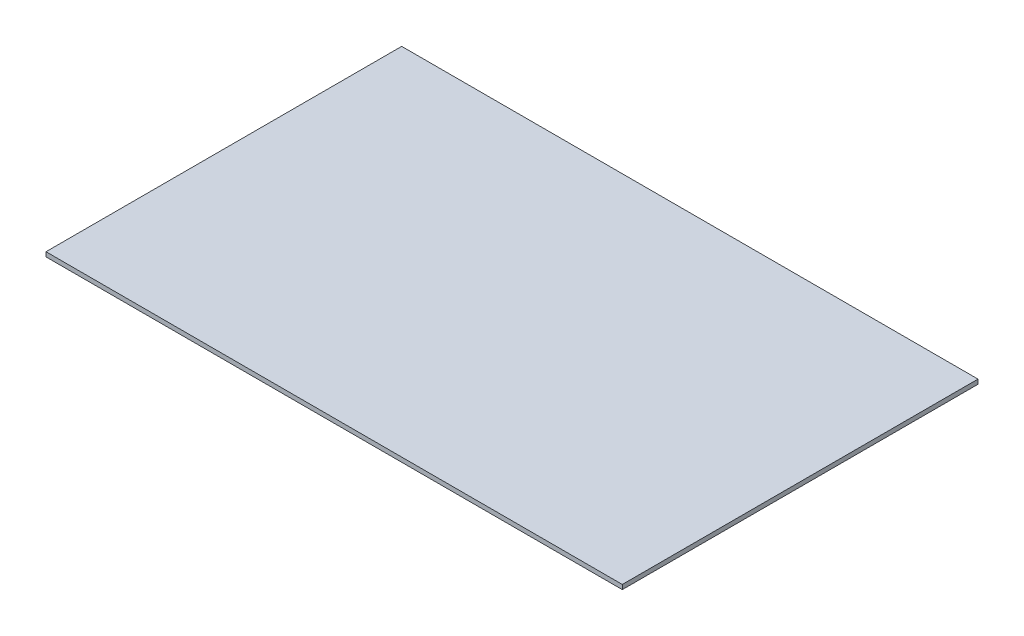
ISO-10303-21;
HEADER;
FILE_DESCRIPTION(('STEP AP214'),'2;1');
FILE_NAME('part.step','',(''),(''),'','','');
FILE_SCHEMA(('AUTOMOTIVE_DESIGN { 1 0 10303 214 1 1 1 1 }'));
ENDSEC;
DATA;
#1=APPLICATION_CONTEXT('core data for automotive mechanical design processes');
#2=APPLICATION_PROTOCOL_DEFINITION('international standard','automotive_design',2000,#1);
#3=PRODUCT_CONTEXT('',#1,'mechanical');
#4=PRODUCT('Part','Part','',(#3));
#5=PRODUCT_RELATED_PRODUCT_CATEGORY('part','',(#4));
#6=PRODUCT_DEFINITION_FORMATION('','',#4);
#7=PRODUCT_DEFINITION_CONTEXT('part definition',#1,'design');
#8=PRODUCT_DEFINITION('design','',#6,#7);
#9=PRODUCT_DEFINITION_SHAPE('','',#8);
#10=(LENGTH_UNIT() NAMED_UNIT(*) SI_UNIT(.MILLI.,.METRE.));
#11=(NAMED_UNIT(*) PLANE_ANGLE_UNIT() SI_UNIT($,.RADIAN.));
#12=(NAMED_UNIT(*) SI_UNIT($,.STERADIAN.) SOLID_ANGLE_UNIT());
#13=UNCERTAINTY_MEASURE_WITH_UNIT(LENGTH_MEASURE(1.E-05),#10,'distance_accuracy_value','');
#14=(GEOMETRIC_REPRESENTATION_CONTEXT(3) GLOBAL_UNCERTAINTY_ASSIGNED_CONTEXT((#13)) GLOBAL_UNIT_ASSIGNED_CONTEXT((#10,
#11,#12)) REPRESENTATION_CONTEXT('',''));
#15=CARTESIAN_POINT('',(0.,0.,0.));
#16=DIRECTION('',(0.,0.,1.));
#17=DIRECTION('',(1.,0.,0.));
#18=AXIS2_PLACEMENT_3D('',#15,#16,#17);
#19=CARTESIAN_POINT('',(0.,1.,39.5));
#20=DIRECTION('',(0.,0.,-1.));
#21=DIRECTION('',(-1.,0.,0.));
#22=AXIS2_PLACEMENT_3D('',#19,#20,#21);
#23=PLANE('',#22);
#24=DIRECTION('',(1.,0.,0.));
#25=VECTOR('',#24,1.);
#26=CARTESIAN_POINT('',(0.,0.,39.5));
#27=LINE('',#26,#25);
#28=CARTESIAN_POINT('',(-64.,0.,39.5));
#29=VERTEX_POINT('',#28);
#30=CARTESIAN_POINT('',(64.,0.,39.5));
#31=VERTEX_POINT('',#30);
#32=EDGE_CURVE('E60',#29,#31,#27,.T.);
#33=ORIENTED_EDGE('',*,*,#32,.T.);
#34=DIRECTION('',(0.,-1.,0.));
#35=VECTOR('',#34,1.);
#36=CARTESIAN_POINT('',(64.,1.,39.5));
#37=LINE('',#36,#35);
#38=CARTESIAN_POINT('',(64.,1.,39.5));
#39=VERTEX_POINT('',#38);
#40=EDGE_CURVE('E11',#39,#31,#37,.T.);
#41=ORIENTED_EDGE('',*,*,#40,.F.);
#42=DIRECTION('',(1.,0.,0.));
#43=VECTOR('',#42,1.);
#44=CARTESIAN_POINT('',(0.,1.,39.5));
#45=LINE('',#44,#43);
#46=CARTESIAN_POINT('',(-64.,1.,39.5));
#47=VERTEX_POINT('',#46);
#48=EDGE_CURVE('E65',#47,#39,#45,.T.);
#49=ORIENTED_EDGE('',*,*,#48,.F.);
#50=DIRECTION('',(0.,-1.,0.));
#51=VECTOR('',#50,1.);
#52=CARTESIAN_POINT('',(-64.,1.,39.5));
#53=LINE('',#52,#51);
#54=EDGE_CURVE('E82',#47,#29,#53,.T.);
#55=ORIENTED_EDGE('',*,*,#54,.T.);
#56=EDGE_LOOP('',(#33,#41,#49,#55));
#57=FACE_BOUND('',#56,.T.);
#58=ADVANCED_FACE('F33',(#57),#23,.F.);
#59=CARTESIAN_POINT('',(64.,1.,-39.5));
#60=DIRECTION('',(-1.,0.,0.));
#61=DIRECTION('',(0.,0.,1.));
#62=AXIS2_PLACEMENT_3D('',#59,#60,#61);
#63=PLANE('',#62);
#64=DIRECTION('',(0.,0.,-1.));
#65=VECTOR('',#64,1.);
#66=CARTESIAN_POINT('',(64.,0.,-39.5));
#67=LINE('',#66,#65);
#68=CARTESIAN_POINT('',(64.,0.,-39.5));
#69=VERTEX_POINT('',#68);
#70=EDGE_CURVE('E79',#31,#69,#67,.T.);
#71=ORIENTED_EDGE('',*,*,#70,.T.);
#72=DIRECTION('',(0.,-1.,0.));
#73=VECTOR('',#72,1.);
#74=CARTESIAN_POINT('',(64.,1.,-39.5));
#75=LINE('',#74,#73);
#76=CARTESIAN_POINT('',(64.,1.,-39.5));
#77=VERTEX_POINT('',#76);
#78=EDGE_CURVE('E41',#77,#69,#75,.T.);
#79=ORIENTED_EDGE('',*,*,#78,.F.);
#80=DIRECTION('',(0.,0.,-1.));
#81=VECTOR('',#80,1.);
#82=CARTESIAN_POINT('',(64.,1.,-39.5));
#83=LINE('',#82,#81);
#84=EDGE_CURVE('E49',#39,#77,#83,.T.);
#85=ORIENTED_EDGE('',*,*,#84,.F.);
#86=ORIENTED_EDGE('',*,*,#40,.T.);
#87=EDGE_LOOP('',(#71,#79,#85,#86));
#88=FACE_BOUND('',#87,.T.);
#89=ADVANCED_FACE('F106',(#88),#63,.F.);
#90=CARTESIAN_POINT('',(0.,1.,-39.5));
#91=DIRECTION('',(0.,0.,1.));
#92=DIRECTION('',(1.,0.,0.));
#93=AXIS2_PLACEMENT_3D('',#90,#91,#92);
#94=PLANE('',#93);
#95=DIRECTION('',(-1.,0.,0.));
#96=VECTOR('',#95,1.);
#97=CARTESIAN_POINT('',(0.,0.,-39.5));
#98=LINE('',#97,#96);
#99=CARTESIAN_POINT('',(-64.,0.,-39.5));
#100=VERTEX_POINT('',#99);
#101=EDGE_CURVE('E96',#69,#100,#98,.T.);
#102=ORIENTED_EDGE('',*,*,#101,.T.);
#103=DIRECTION('',(0.,-1.,0.));
#104=VECTOR('',#103,1.);
#105=CARTESIAN_POINT('',(-64.,1.,-39.5));
#106=LINE('',#105,#104);
#107=CARTESIAN_POINT('',(-64.,1.,-39.5));
#108=VERTEX_POINT('',#107);
#109=EDGE_CURVE('E80',#108,#100,#106,.T.);
#110=ORIENTED_EDGE('',*,*,#109,.F.);
#111=DIRECTION('',(-1.,0.,0.));
#112=VECTOR('',#111,1.);
#113=CARTESIAN_POINT('',(0.,1.,-39.5));
#114=LINE('',#113,#112);
#115=EDGE_CURVE('E98',#77,#108,#114,.T.);
#116=ORIENTED_EDGE('',*,*,#115,.F.);
#117=ORIENTED_EDGE('',*,*,#78,.T.);
#118=EDGE_LOOP('',(#102,#110,#116,#117));
#119=FACE_BOUND('',#118,.T.);
#120=ADVANCED_FACE('F104',(#119),#94,.F.);
#121=CARTESIAN_POINT('',(0.,1.,0.));
#122=DIRECTION('',(0.,1.,0.));
#123=DIRECTION('',(0.,0.,1.));
#124=AXIS2_PLACEMENT_3D('',#121,#122,#123);
#125=PLANE('',#124);
#126=ORIENTED_EDGE('',*,*,#115,.T.);
#127=DIRECTION('',(0.,0.,-1.));
#128=VECTOR('',#127,1.);
#129=CARTESIAN_POINT('',(-64.,1.,-39.5));
#130=LINE('',#129,#128);
#131=EDGE_CURVE('E86',#47,#108,#130,.T.);
#132=ORIENTED_EDGE('',*,*,#131,.F.);
#133=ORIENTED_EDGE('',*,*,#48,.T.);
#134=ORIENTED_EDGE('',*,*,#84,.T.);
#135=EDGE_LOOP('',(#126,#132,#133,#134));
#136=FACE_BOUND('',#135,.T.);
#137=ADVANCED_FACE('F112',(#136),#125,.T.);
#138=CARTESIAN_POINT('',(0.,0.,0.));
#139=DIRECTION('',(0.,1.,0.));
#140=DIRECTION('',(0.,0.,1.));
#141=AXIS2_PLACEMENT_3D('',#138,#139,#140);
#142=PLANE('',#141);
#143=ORIENTED_EDGE('',*,*,#32,.F.);
#144=DIRECTION('',(0.,0.,-1.));
#145=VECTOR('',#144,1.);
#146=CARTESIAN_POINT('',(-64.,0.,-39.5));
#147=LINE('',#146,#145);
#148=EDGE_CURVE('E78',#29,#100,#147,.T.);
#149=ORIENTED_EDGE('',*,*,#148,.T.);
#150=ORIENTED_EDGE('',*,*,#101,.F.);
#151=ORIENTED_EDGE('',*,*,#70,.F.);
#152=EDGE_LOOP('',(#143,#149,#150,#151));
#153=FACE_BOUND('',#152,.T.);
#154=ADVANCED_FACE('F75',(#153),#142,.F.);
#155=CARTESIAN_POINT('',(-64.,1.,-39.5));
#156=DIRECTION('',(-1.,0.,0.));
#157=DIRECTION('',(0.,0.,1.));
#158=AXIS2_PLACEMENT_3D('',#155,#156,#157);
#159=PLANE('',#158);
#160=ORIENTED_EDGE('',*,*,#148,.F.);
#161=ORIENTED_EDGE('',*,*,#54,.F.);
#162=ORIENTED_EDGE('',*,*,#131,.T.);
#163=ORIENTED_EDGE('',*,*,#109,.T.);
#164=EDGE_LOOP('',(#160,#161,#162,#163));
#165=FACE_BOUND('',#164,.T.);
#166=ADVANCED_FACE('F89',(#165),#159,.T.);
#167=CLOSED_SHELL('',(#58,#89,#120,#137,#154,#166));
#168=MANIFOLD_SOLID_BREP('B2',#167);
#169=ADVANCED_BREP_SHAPE_REPRESENTATION('',(#18,#168),#14);
#170=SHAPE_DEFINITION_REPRESENTATION(#9,#169);
ENDSEC;
END-ISO-10303-21;
